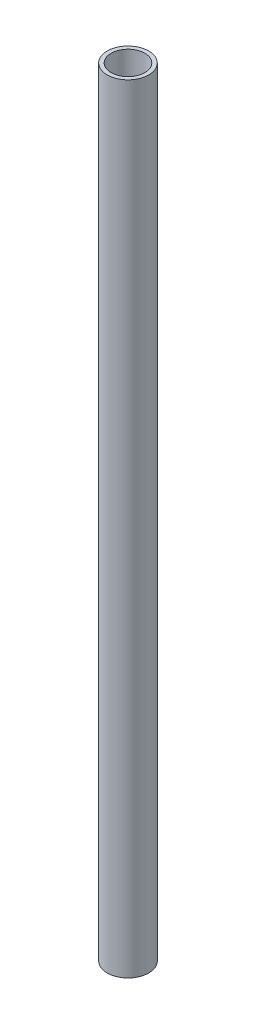
ISO-10303-21;
HEADER;
FILE_DESCRIPTION(('STEP AP214'),'2;1');
FILE_NAME('part.step','',(''),(''),'','','');
FILE_SCHEMA(('AUTOMOTIVE_DESIGN { 1 0 10303 214 1 1 1 1 }'));
ENDSEC;
DATA;
#1=APPLICATION_CONTEXT('core data for automotive mechanical design processes');
#2=APPLICATION_PROTOCOL_DEFINITION('international standard','automotive_design',2000,#1);
#3=PRODUCT_CONTEXT('',#1,'mechanical');
#4=PRODUCT('Part','Part','',(#3));
#5=PRODUCT_RELATED_PRODUCT_CATEGORY('part','',(#4));
#6=PRODUCT_DEFINITION_FORMATION('','',#4);
#7=PRODUCT_DEFINITION_CONTEXT('part definition',#1,'design');
#8=PRODUCT_DEFINITION('design','',#6,#7);
#9=PRODUCT_DEFINITION_SHAPE('','',#8);
#10=(LENGTH_UNIT() NAMED_UNIT(*) SI_UNIT(.MILLI.,.METRE.));
#11=(NAMED_UNIT(*) PLANE_ANGLE_UNIT() SI_UNIT($,.RADIAN.));
#12=(NAMED_UNIT(*) SI_UNIT($,.STERADIAN.) SOLID_ANGLE_UNIT());
#13=UNCERTAINTY_MEASURE_WITH_UNIT(LENGTH_MEASURE(1.E-05),#10,'distance_accuracy_value','');
#14=(GEOMETRIC_REPRESENTATION_CONTEXT(3) GLOBAL_UNCERTAINTY_ASSIGNED_CONTEXT((#13)) GLOBAL_UNIT_ASSIGNED_CONTEXT((#10,
#11,#12)) REPRESENTATION_CONTEXT('',''));
#15=CARTESIAN_POINT('',(0.,0.,0.));
#16=DIRECTION('',(0.,0.,1.));
#17=DIRECTION('',(1.,0.,0.));
#18=AXIS2_PLACEMENT_3D('',#15,#16,#17);
#19=CARTESIAN_POINT('',(0.,300.,0.));
#20=DIRECTION('',(0.,1.,0.));
#21=DIRECTION('',(0.,0.,1.));
#22=AXIS2_PLACEMENT_3D('',#19,#20,#21);
#23=PLANE('',#22);
#24=CARTESIAN_POINT('',(0.,300.,0.));
#25=DIRECTION('',(0.,1.,0.));
#26=DIRECTION('',(0.,0.,1.));
#27=AXIS2_PLACEMENT_3D('',#24,#25,#26);
#28=CIRCLE('',#27,8.);
#29=CARTESIAN_POINT('',(0.,300.,8.));
#30=VERTEX_POINT('',#29);
#31=EDGE_CURVE('E10',#30,#30,#28,.T.);
#32=ORIENTED_EDGE('',*,*,#31,.T.);
#33=EDGE_LOOP('',(#32));
#34=FACE_BOUND('',#33,.T.);
#35=CARTESIAN_POINT('',(0.,300.,0.));
#36=DIRECTION('',(0.,1.,0.));
#37=DIRECTION('',(0.,0.,1.));
#38=AXIS2_PLACEMENT_3D('',#35,#36,#37);
#39=CIRCLE('',#38,6.5);
#40=CARTESIAN_POINT('',(0.,300.,6.5));
#41=VERTEX_POINT('',#40);
#42=EDGE_CURVE('E48',#41,#41,#39,.T.);
#43=ORIENTED_EDGE('',*,*,#42,.F.);
#44=EDGE_LOOP('',(#43));
#45=FACE_BOUND('',#44,.T.);
#46=ADVANCED_FACE('F37',(#34,#45),#23,.T.);
#47=CARTESIAN_POINT('',(0.,0.,0.));
#48=DIRECTION('',(0.,1.,0.));
#49=DIRECTION('',(0.,0.,1.));
#50=AXIS2_PLACEMENT_3D('',#47,#48,#49);
#51=PLANE('',#50);
#52=CARTESIAN_POINT('',(0.,0.,0.));
#53=DIRECTION('',(0.,1.,0.));
#54=DIRECTION('',(0.,0.,1.));
#55=AXIS2_PLACEMENT_3D('',#52,#53,#54);
#56=CIRCLE('',#55,8.);
#57=CARTESIAN_POINT('',(0.,0.,8.));
#58=VERTEX_POINT('',#57);
#59=EDGE_CURVE('E41',#58,#58,#56,.T.);
#60=ORIENTED_EDGE('',*,*,#59,.F.);
#61=EDGE_LOOP('',(#60));
#62=FACE_BOUND('',#61,.T.);
#63=CARTESIAN_POINT('',(0.,0.,0.));
#64=DIRECTION('',(0.,1.,0.));
#65=DIRECTION('',(0.,0.,1.));
#66=AXIS2_PLACEMENT_3D('',#63,#64,#65);
#67=CIRCLE('',#66,6.5);
#68=CARTESIAN_POINT('',(0.,0.,6.5));
#69=VERTEX_POINT('',#68);
#70=EDGE_CURVE('E50',#69,#69,#67,.T.);
#71=ORIENTED_EDGE('',*,*,#70,.T.);
#72=EDGE_LOOP('',(#71));
#73=FACE_BOUND('',#72,.T.);
#74=ADVANCED_FACE('F60',(#62,#73),#51,.F.);
#75=CARTESIAN_POINT('',(0.,300.,0.));
#76=DIRECTION('',(0.,-1.,0.));
#77=DIRECTION('',(0.,0.,-1.));
#78=AXIS2_PLACEMENT_3D('',#75,#76,#77);
#79=CYLINDRICAL_SURFACE('',#78,8.);
#80=ORIENTED_EDGE('',*,*,#31,.F.);
#81=EDGE_LOOP('',(#80));
#82=FACE_BOUND('',#81,.T.);
#83=ORIENTED_EDGE('',*,*,#59,.T.);
#84=EDGE_LOOP('',(#83));
#85=FACE_BOUND('',#84,.T.);
#86=ADVANCED_FACE('F39',(#82,#85),#79,.T.);
#87=CARTESIAN_POINT('',(0.,300.,0.));
#88=DIRECTION('',(0.,-1.,0.));
#89=DIRECTION('',(0.,0.,-1.));
#90=AXIS2_PLACEMENT_3D('',#87,#88,#89);
#91=CYLINDRICAL_SURFACE('',#90,6.5);
#92=ORIENTED_EDGE('',*,*,#42,.T.);
#93=EDGE_LOOP('',(#92));
#94=FACE_BOUND('',#93,.T.);
#95=ORIENTED_EDGE('',*,*,#70,.F.);
#96=EDGE_LOOP('',(#95));
#97=FACE_BOUND('',#96,.T.);
#98=ADVANCED_FACE('F56',(#94,#97),#91,.F.);
#99=CLOSED_SHELL('',(#46,#74,#86,#98));
#100=MANIFOLD_SOLID_BREP('B2',#99);
#101=ADVANCED_BREP_SHAPE_REPRESENTATION('',(#18,#100),#14);
#102=SHAPE_DEFINITION_REPRESENTATION(#9,#101);
ENDSEC;
END-ISO-10303-21;
